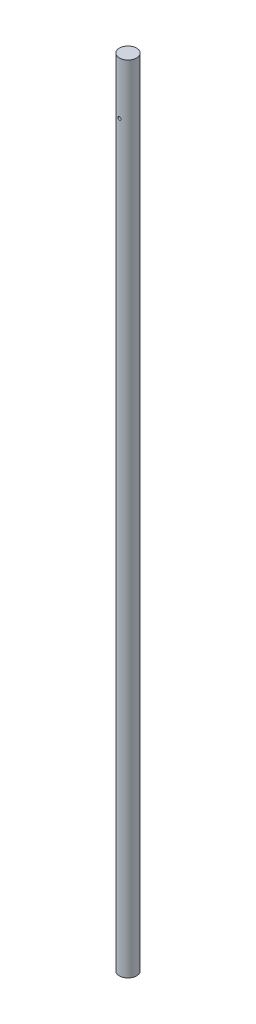
ISO-10303-21;
HEADER;
FILE_DESCRIPTION(('STEP AP214'),'2;1');
FILE_NAME('part.step','',(''),(''),'','','');
FILE_SCHEMA(('AUTOMOTIVE_DESIGN { 1 0 10303 214 1 1 1 1 }'));
ENDSEC;
DATA;
#1=APPLICATION_CONTEXT('core data for automotive mechanical design processes');
#2=APPLICATION_PROTOCOL_DEFINITION('international standard','automotive_design',2000,#1);
#3=PRODUCT_CONTEXT('',#1,'mechanical');
#4=PRODUCT('Part','Part','',(#3));
#5=PRODUCT_RELATED_PRODUCT_CATEGORY('part','',(#4));
#6=PRODUCT_DEFINITION_FORMATION('','',#4);
#7=PRODUCT_DEFINITION_CONTEXT('part definition',#1,'design');
#8=PRODUCT_DEFINITION('design','',#6,#7);
#9=PRODUCT_DEFINITION_SHAPE('','',#8);
#10=(LENGTH_UNIT() NAMED_UNIT(*) SI_UNIT(.MILLI.,.METRE.));
#11=(NAMED_UNIT(*) PLANE_ANGLE_UNIT() SI_UNIT($,.RADIAN.));
#12=(NAMED_UNIT(*) SI_UNIT($,.STERADIAN.) SOLID_ANGLE_UNIT());
#13=UNCERTAINTY_MEASURE_WITH_UNIT(LENGTH_MEASURE(1.E-05),#10,'distance_accuracy_value','');
#14=(GEOMETRIC_REPRESENTATION_CONTEXT(3) GLOBAL_UNCERTAINTY_ASSIGNED_CONTEXT((#13)) GLOBAL_UNIT_ASSIGNED_CONTEXT((#10,
#11,#12)) REPRESENTATION_CONTEXT('',''));
#15=CARTESIAN_POINT('',(0.,0.,0.));
#16=DIRECTION('',(0.,0.,1.));
#17=DIRECTION('',(1.,0.,0.));
#18=AXIS2_PLACEMENT_3D('',#15,#16,#17);
#19=CARTESIAN_POINT('',(0.,1500.,0.));
#20=DIRECTION('',(0.,-1.,0.));
#21=DIRECTION('',(0.,0.,-1.));
#22=AXIS2_PLACEMENT_3D('',#19,#20,#21);
#23=CYLINDRICAL_SURFACE('',#22,16.25);
#24=CARTESIAN_POINT('',(0.,1404.32914564067,-16.25));
#25=CARTESIAN_POINT('',(-0.166990748406522,1404.32913921038,-16.2499969931893));
#26=CARTESIAN_POINT('',(-0.334065704183964,1404.31515557109,-16.2473993044584));
#27=CARTESIAN_POINT('',(-0.663510750076011,1404.25962464219,-16.2372869543503));
#28=CARTESIAN_POINT('',(-0.82587669378066,1404.21805378697,-16.2297680892719));
#29=CARTESIAN_POINT('',(-1.14109129945687,1404.10866205032,-16.2106547951056));
#30=CARTESIAN_POINT('',(-1.29394829948251,1404.04086455373,-16.1990639975787));
#31=CARTESIAN_POINT('',(-1.58610277423743,1403.88100970992,-16.1730738034434));
#32=CARTESIAN_POINT('',(-1.72540141027467,1403.78895444294,-16.1586746476957));
#33=CARTESIAN_POINT('',(-1.9881193605143,1403.58206072673,-16.1284708734998));
#34=CARTESIAN_POINT('',(-2.11135823097165,1403.46699503101,-16.1126531819756));
#35=CARTESIAN_POINT('',(-2.33689766600412,1403.21783564233,-16.0814925513269));
#36=CARTESIAN_POINT('',(-2.43919675421193,1403.08374060883,-16.0661496457423));
#37=CARTESIAN_POINT('',(-2.62069930792588,1402.79905891854,-16.0375487829896));
#38=CARTESIAN_POINT('',(-2.69971995505486,1402.64835386056,-16.0243076876981));
#39=CARTESIAN_POINT('',(-2.83125237447274,1402.33552231303,-16.0015934725703));
#40=CARTESIAN_POINT('',(-2.88376635991726,1402.17339677832,-15.9921200381696));
#41=CARTESIAN_POINT('',(-2.96021718211588,1401.84425464954,-15.9781451500924));
#42=CARTESIAN_POINT('',(-2.98446826157052,1401.67731341075,-15.9735890655203));
#43=CARTESIAN_POINT('',(-3.00468010974617,1401.34167412396,-15.9697999512075));
#44=CARTESIAN_POINT('',(-3.00064333711198,1401.1729762299,-15.9705664588524));
#45=CARTESIAN_POINT('',(-2.96464904683336,1400.84088410826,-15.9772861635864));
#46=CARTESIAN_POINT('',(-2.93304822684279,1400.67744968101,-15.9831730961327));
#47=CARTESIAN_POINT('',(-2.84338433308752,1400.35824279567,-15.9993663109862));
#48=CARTESIAN_POINT('',(-2.78532016603667,1400.20247065442,-16.0096727758775));
#49=CARTESIAN_POINT('',(-2.64402712252059,1399.90196296112,-16.0336133834124));
#50=CARTESIAN_POINT('',(-2.56065362503224,1399.7572969862,-16.0472665609575));
#51=CARTESIAN_POINT('',(-2.37121092505861,1399.48387386111,-16.076349550406));
#52=CARTESIAN_POINT('',(-2.26513948730052,1399.35511827975,-16.0917795372189));
#53=CARTESIAN_POINT('',(-2.03138577740134,1399.11510936863,-16.1229666648261));
#54=CARTESIAN_POINT('',(-1.90339826990373,1399.0041532866,-16.138725203635));
#55=CARTESIAN_POINT('',(-1.63046847336349,1398.80524267303,-16.16857715743));
#56=CARTESIAN_POINT('',(-1.48552602404784,1398.71728835895,-16.1826705566731));
#57=CARTESIAN_POINT('',(-1.18249510750696,1398.56683663616,-16.2076314364601));
#58=CARTESIAN_POINT('',(-1.02439129145662,1398.50436946593,-16.2184950810362));
#59=CARTESIAN_POINT('',(-0.699689597220758,1398.40696217655,-16.2357426253031));
#60=CARTESIAN_POINT('',(-0.533092595258714,1398.37201922387,-16.2421269861125));
#61=CARTESIAN_POINT('',(-0.198691607679679,1398.33106444276,-16.2496334732719));
#62=CARTESIAN_POINT('',(-0.0309391242633955,1398.32464522728,-16.2508296926954));
#63=CARTESIAN_POINT('',(0.303242454906818,1398.33982833108,-16.2480295318427));
#64=CARTESIAN_POINT('',(0.469671613237506,1398.36142931732,-16.2440333985867));
#65=CARTESIAN_POINT('',(0.795194961889502,1398.43170092045,-16.2313436394118));
#66=CARTESIAN_POINT('',(0.954335024232843,1398.48016604455,-16.2226856875138));
#67=CARTESIAN_POINT('',(1.26223093849576,1398.60256828402,-16.2016390601323));
#68=CARTESIAN_POINT('',(1.41098610150155,1398.67650708735,-16.1892501374326));
#69=CARTESIAN_POINT('',(1.6956327395767,1398.84866404323,-16.1619310186895));
#70=CARTESIAN_POINT('',(1.8313706640138,1398.94713193149,-16.1469752087126));
#71=CARTESIAN_POINT('',(2.0845421763647,1399.1652131747,-16.1162488496669));
#72=CARTESIAN_POINT('',(2.20197410901898,1399.28482843975,-16.1004782270929));
#73=CARTESIAN_POINT('',(2.41674271353206,1399.5436509116,-16.0696547785828));
#74=CARTESIAN_POINT('',(2.51380175615245,1399.68309013404,-16.054613781122));
#75=CARTESIAN_POINT('',(2.68311937298541,1399.97653297996,-16.0271880822755));
#76=CARTESIAN_POINT('',(2.75537885119932,1400.1305360723,-16.0148032840714));
#77=CARTESIAN_POINT('',(2.8726493810387,1400.4480199125,-15.9941844859827));
#78=CARTESIAN_POINT('',(2.91778926237291,1400.61145174226,-15.9859308928403));
#79=CARTESIAN_POINT('',(2.97993782777897,1400.94374608357,-15.9744635860761));
#80=CARTESIAN_POINT('',(2.99694957789979,1401.11260800117,-15.9712493231544));
#81=CARTESIAN_POINT('',(3.00225883844445,1401.44818953388,-15.970251870614));
#82=CARTESIAN_POINT('',(2.99099413231231,1401.6149021345,-15.97238587689));
#83=CARTESIAN_POINT('',(2.94102698494465,1401.94401418782,-15.9816612146416));
#84=CARTESIAN_POINT('',(2.90232469587026,1402.10641366444,-15.988802518348));
#85=CARTESIAN_POINT('',(2.7987633004443,1402.42206363133,-16.0072534221724));
#86=CARTESIAN_POINT('',(2.73395019866579,1402.57532967139,-16.0185556880998));
#87=CARTESIAN_POINT('',(2.58005440045498,1402.86888248486,-16.0440604738932));
#88=CARTESIAN_POINT('',(2.49097006205162,1403.00916837928,-16.058263189961));
#89=CARTESIAN_POINT('',(2.28953267949521,1403.27497443114,-16.0882264295535));
#90=CARTESIAN_POINT('',(2.17686050825663,1403.40025057059,-16.1040065806901));
#91=CARTESIAN_POINT('',(1.93211250705098,1403.6302644882,-16.1351984458799));
#92=CARTESIAN_POINT('',(1.80003222426299,1403.73499754024,-16.1506100744366));
#93=CARTESIAN_POINT('',(1.5188437124447,1403.92179999195,-16.1794852499055));
#94=CARTESIAN_POINT('',(1.36959751004411,1404.00366457749,-16.1929307079667));
#95=CARTESIAN_POINT('',(1.05927137362299,1404.14102771242,-16.2161821483934));
#96=CARTESIAN_POINT('',(0.898202820996959,1404.19655124572,-16.2259915775145));
#97=CARTESIAN_POINT('',(0.61386466592793,1404.26826862272,-16.2388451896062));
#98=CARTESIAN_POINT('',(0.492266320876404,1404.29105885181,-16.2430048058652));
#99=CARTESIAN_POINT('',(0.247127326642421,1404.32149955774,-16.2485832906629));
#100=CARTESIAN_POINT('',(0.123586724363565,1404.32915039961,-16.2500022252843));
#101=CARTESIAN_POINT('',(0.,1404.32914564067,-16.25));
#102=B_SPLINE_CURVE_WITH_KNOTS('',3,(#24,#25,#26,#27,#28,#29,#30,#31,#32,#33,#34,#35,#36,#37,
#38,#39,#40,#41,#42,#43,#44,#45,#46,#47,#48,#49,#50,#51,#52,#53,#54,#55,#56,#57,#58,#59,#60,#61,
#62,#63,#64,#65,#66,#67,#68,#69,#70,#71,#72,#73,#74,#75,#76,#77,#78,#79,#80,#81,#82,#83,#84,#85,
#86,#87,#88,#89,#90,#91,#92,#93,#94,#95,#96,#97,#98,#99,#100,#101),.UNSPECIFIED.,.T.,.F.,(4,2,2,
2,2,2,2,2,2,2,2,2,2,2,2,2,2,2,2,2,2,2,2,2,2,2,2,2,2,2,2,2,2,2,2,2,2,2,4),(0.,0.500520313143171,
1.00146873301012,1.50197151053382,2.00243138094156,2.50810222383683,3.01380870697637,
3.52338692194337,4.03292258298424,4.5367371998035,5.040508028009,5.5378548446814,
6.03522221021627,6.53548687763446,7.03580083335983,7.54375379071424,8.05171155007453,
8.56027022073788,9.06877653027074,9.56999631726773,10.0711922601603,10.5686062634814,
11.0660532329751,11.568788087258,12.071568373363,12.5808097011882,13.0900324640199,
13.5968166696747,14.1035456307191,14.6024778204238,15.1014072432122,15.5994614214479,
16.0975493018683,16.6028705542164,17.1083079244305,17.6181366775963,18.1274808976006,
18.4979155361608,18.8683412427886),.UNSPECIFIED.);
#103=CARTESIAN_POINT('',(0.,1404.32914564067,-16.25));
#104=VERTEX_POINT('',#103);
#105=EDGE_CURVE('E10',#104,#104,#102,.T.);
#106=ORIENTED_EDGE('',*,*,#105,.T.);
#107=EDGE_LOOP('',(#106));
#108=FACE_BOUND('',#107,.T.);
#109=CARTESIAN_POINT('',(3.,1401.32914564067,15.9706762536844));
#110=CARTESIAN_POINT('',(2.99999354777675,1401.16218222839,15.9706794597759));
#111=CARTESIAN_POINT('',(2.98601433158227,1400.99513454677,15.9733229245078));
#112=CARTESIAN_POINT('',(2.93050256371947,1400.66574614098,15.9835985131928));
#113=CARTESIAN_POINT('',(2.88894634320748,1400.50340958532,15.9912349224169));
#114=CARTESIAN_POINT('',(2.77959739628982,1400.18825720017,16.0106027109374));
#115=CARTESIAN_POINT('',(2.71182874366636,1400.0354327837,16.022330331854));
#116=CARTESIAN_POINT('',(2.55204188071271,1399.74333318108,16.0485546895875));
#117=CARTESIAN_POINT('',(2.46002568319122,1399.6040568716,16.0630511965294));
#118=CARTESIAN_POINT('',(2.25317191477204,1399.34131485868,16.0933753619552));
#119=CARTESIAN_POINT('',(2.13809833041726,1399.21803640377,16.1092157194583));
#120=CARTESIAN_POINT('',(1.88890639443754,1398.9924202419,16.1403305247396));
#121=CARTESIAN_POINT('',(1.75478681166655,1398.89008388971,16.155604935854));
#122=CARTESIAN_POINT('',(1.47008247559534,1398.70854143893,16.1840026485545));
#123=CARTESIAN_POINT('',(1.3193835433783,1398.62951156546,16.1971092478474));
#124=CARTESIAN_POINT('',(1.00656526274699,1398.49796041381,16.2195525507175));
#125=CARTESIAN_POINT('',(0.844446825747186,1398.44543702282,16.2288895547545));
#126=CARTESIAN_POINT('',(0.515331102463596,1398.36896790968,16.2426519505925));
#127=CARTESIAN_POINT('',(0.348409430124719,1398.34470666578,16.2471315313766));
#128=CARTESIAN_POINT('',(0.0128088004499623,1398.32446770314,16.2508610434255));
#129=CARTESIAN_POINT('',(-0.155870010474528,1398.32848764644,16.2501114069826));
#130=CARTESIAN_POINT('',(-0.488033874506789,1398.36445437126,16.2435093748819));
#131=CARTESIAN_POINT('',(-0.651557123478107,1398.3960614402,16.2377190533405));
#132=CARTESIAN_POINT('',(-0.970938386011763,1398.48576826662,16.2217558088034));
#133=CARTESIAN_POINT('',(-1.12679612635382,1398.54386896766,16.21158272972));
#134=CARTESIAN_POINT('',(-1.4274111235155,1398.68523948599,16.1878929801162));
#135=CARTESIAN_POINT('',(-1.5721027533246,1398.76864570718,16.1743582629772));
#136=CARTESIAN_POINT('',(-1.8455635013331,1398.95815924923,16.1454430573474));
#137=CARTESIAN_POINT('',(-1.97433104593745,1399.06426881077,16.1300623867377));
#138=CARTESIAN_POINT('',(-2.21430037510118,1399.29805077093,16.0988899829771));
#139=CARTESIAN_POINT('',(-2.32521249475572,1399.42602033718,16.0830955382294));
#140=CARTESIAN_POINT('',(-2.5240427889418,1399.69889816542,16.0530947028669));
#141=CARTESIAN_POINT('',(-2.61196064700433,1399.84380666051,16.0388883341104));
#142=CARTESIAN_POINT('',(-2.76238558105924,1400.14682596925,16.0136685487596));
#143=CARTESIAN_POINT('',(-2.82485161332127,1400.30495761567,16.0026602976023));
#144=CARTESIAN_POINT('',(-2.92224821523406,1400.62972014687,15.9851630672249));
#145=CARTESIAN_POINT('',(-2.9571818023361,1400.79635009813,15.9786735927732));
#146=CARTESIAN_POINT('',(-2.99810114582988,1401.13077013267,15.971046358097));
#147=CARTESIAN_POINT('',(-3.00450259132285,1401.29850765184,15.9698317542347));
#148=CARTESIAN_POINT('',(-2.98928929224691,1401.63265513164,15.97268628894));
#149=CARTESIAN_POINT('',(-2.96767588861772,1401.79906515543,15.9767551746116));
#150=CARTESIAN_POINT('',(-2.89740292808406,1402.12447399469,15.9896467322389));
#151=CARTESIAN_POINT('',(-2.84896036886119,1402.28352131861,15.9984312462829));
#152=CARTESIAN_POINT('',(-2.72663405906852,1402.59124165801,16.0197315181041));
#153=CARTESIAN_POINT('',(-2.65274848351888,1402.73991392838,16.032247543527));
#154=CARTESIAN_POINT('',(-2.48067322170112,1403.02449793051,16.059776105751));
#155=CARTESIAN_POINT('',(-2.38222038834149,1403.16024794609,16.0748150539442));
#156=CARTESIAN_POINT('',(-2.16416108164263,1403.41345078917,16.105620237341));
#157=CARTESIAN_POINT('',(-2.04455276697753,1403.53090202232,16.1213865357631));
#158=CARTESIAN_POINT('',(-1.78572328816145,1403.74572119773,16.1521163309701));
#159=CARTESIAN_POINT('',(-1.64626858473754,1403.84280990837,16.1670668159048));
#160=CARTESIAN_POINT('',(-1.35278600878872,1404.01217951172,16.1942630633782));
#161=CARTESIAN_POINT('',(-1.19875868545359,1404.08446133884,16.2065089277864));
#162=CARTESIAN_POINT('',(-0.881283032110591,1404.20174494195,16.2268601132755));
#163=CARTESIAN_POINT('',(-0.717887243845897,1404.24688514453,16.2349864108848));
#164=CARTESIAN_POINT('',(-0.385669631467762,1404.30904653143,16.246272219738));
#165=CARTESIAN_POINT('',(-0.216848361869866,1404.32607058012,16.2494322369274));
#166=CARTESIAN_POINT('',(0.118747704707803,1404.33141918498,16.2504197985129));
#167=CARTESIAN_POINT('',(0.285515689688133,1404.32016591994,16.2483257859918));
#168=CARTESIAN_POINT('',(0.614741545752406,1404.27020230881,16.2392031583745));
#169=CARTESIAN_POINT('',(0.777199455456259,1404.23149220882,16.2321745875094));
#170=CARTESIAN_POINT('',(1.09297936585808,1404.12788942784,16.2139720430151));
#171=CARTESIAN_POINT('',(1.24631610722904,1404.06304038618,16.2028049811471));
#172=CARTESIAN_POINT('',(1.53999557536848,1403.90905059106,16.1775357709178));
#173=CARTESIAN_POINT('',(1.68033746660064,1403.81990827706,16.1634334340149));
#174=CARTESIAN_POINT('',(1.9461506514831,1403.6184027985,16.1336033970312));
#175=CARTESIAN_POINT('',(2.07138804784198,1403.50573399834,16.1178558238246));
#176=CARTESIAN_POINT('',(2.3013253609755,1403.2610092354,16.0866373015376));
#177=CARTESIAN_POINT('',(2.40602044567497,1403.12894872394,16.0711664183176));
#178=CARTESIAN_POINT('',(2.59277671744308,1402.84778033234,16.0421023052171));
#179=CARTESIAN_POINT('',(2.67462754970741,1402.69853081917,16.0285270664137));
#180=CARTESIAN_POINT('',(2.81196408585683,1402.38819870641,16.0050071148391));
#181=CARTESIAN_POINT('',(2.86747488923755,1402.22712754144,15.9950589479226));
#182=CARTESIAN_POINT('',(2.93916049492629,1401.94282235911,15.9820131761365));
#183=CARTESIAN_POINT('',(2.96193657807252,1401.82126170405,15.9777868392098));
#184=CARTESIAN_POINT('',(2.99235852299139,1401.57619792719,15.9721172276098));
#185=CARTESIAN_POINT('',(3.00000477450181,1401.45269485549,15.970673881248));
#186=CARTESIAN_POINT('',(3.,1401.32914564067,15.9706762536844));
#187=B_SPLINE_CURVE_WITH_KNOTS('',3,(#109,#110,#111,#112,#113,#114,#115,#116,#117,#118,#119,
#120,#121,#122,#123,#124,#125,#126,#127,#128,#129,#130,#131,#132,#133,#134,#135,#136,#137,#138,
#139,#140,#141,#142,#143,#144,#145,#146,#147,#148,#149,#150,#151,#152,#153,#154,#155,#156,#157,
#158,#159,#160,#161,#162,#163,#164,#165,#166,#167,#168,#169,#170,#171,#172,#173,#174,#175,#176,
#177,#178,#179,#180,#181,#182,#183,#184,#185,#186),.UNSPECIFIED.,.T.,.F.,(4,2,2,2,2,2,2,2,2,2,2,
2,2,2,2,2,2,2,2,2,2,2,2,2,2,2,2,2,2,2,2,2,2,2,2,2,2,2,4),(0.,0.500438156684197,1.00130638686238,
1.50171570229904,2.00208349142415,2.50786186721795,3.01367295175818,3.52321589904848,
4.03271822463385,4.53647617945055,5.04019248977093,5.53779209665988,6.03540942656375,
6.5357582012866,7.03615638030867,7.54399523169793,8.05184107208306,8.5605026562576,
9.06910848530204,9.57027961399998,10.0714267548676,10.568578528325,11.0657659689771,
11.5685265026893,12.0713308171088,12.5806346209648,13.0899192386275,13.5965838922151,
14.1031969254119,14.6022913276744,15.1013812563505,15.5996413758659,16.0979335100448,
16.6031540423846,17.1084932733705,17.6183428161172,18.1277055411018,18.4980281957539,
18.8683413109338),.UNSPECIFIED.);
#188=CARTESIAN_POINT('',(3.,1401.32914564067,15.9706762536844));
#189=VERTEX_POINT('',#188);
#190=EDGE_CURVE('E40',#189,#189,#187,.T.);
#191=ORIENTED_EDGE('',*,*,#190,.T.);
#192=EDGE_LOOP('',(#191));
#193=FACE_BOUND('',#192,.T.);
#194=CARTESIAN_POINT('',(0.,1500.,0.));
#195=DIRECTION('',(0.,1.,0.));
#196=DIRECTION('',(0.,0.,1.));
#197=AXIS2_PLACEMENT_3D('',#194,#195,#196);
#198=CIRCLE('',#197,16.25);
#199=CARTESIAN_POINT('',(0.,1500.,16.25));
#200=VERTEX_POINT('',#199);
#201=EDGE_CURVE('E44',#200,#200,#198,.T.);
#202=ORIENTED_EDGE('',*,*,#201,.F.);
#203=EDGE_LOOP('',(#202));
#204=FACE_BOUND('',#203,.T.);
#205=CARTESIAN_POINT('',(0.,0.,0.));
#206=DIRECTION('',(0.,1.,0.));
#207=DIRECTION('',(0.,0.,1.));
#208=AXIS2_PLACEMENT_3D('',#205,#206,#207);
#209=CIRCLE('',#208,16.25);
#210=CARTESIAN_POINT('',(0.,0.,16.25));
#211=VERTEX_POINT('',#210);
#212=EDGE_CURVE('E48',#211,#211,#209,.T.);
#213=ORIENTED_EDGE('',*,*,#212,.T.);
#214=EDGE_LOOP('',(#213));
#215=FACE_BOUND('',#214,.T.);
#216=ADVANCED_FACE('F30',(#108,#193,#204,#215),#23,.T.);
#217=CARTESIAN_POINT('',(0.,1500.,0.));
#218=DIRECTION('',(0.,1.,0.));
#219=DIRECTION('',(0.,0.,1.));
#220=AXIS2_PLACEMENT_3D('',#217,#218,#219);
#221=PLANE('',#220);
#222=ORIENTED_EDGE('',*,*,#201,.T.);
#223=EDGE_LOOP('',(#222));
#224=FACE_BOUND('',#223,.T.);
#225=ADVANCED_FACE('F59',(#224),#221,.T.);
#226=CARTESIAN_POINT('',(0.,0.,0.));
#227=DIRECTION('',(0.,1.,0.));
#228=DIRECTION('',(0.,0.,1.));
#229=AXIS2_PLACEMENT_3D('',#226,#227,#228);
#230=PLANE('',#229);
#231=ORIENTED_EDGE('',*,*,#212,.F.);
#232=EDGE_LOOP('',(#231));
#233=FACE_BOUND('',#232,.T.);
#234=ADVANCED_FACE('F57',(#233),#230,.F.);
#235=CARTESIAN_POINT('',(0.,1401.32914564067,16.25));
#236=DIRECTION('',(0.,0.,1.));
#237=DIRECTION('',(1.,0.,0.));
#238=AXIS2_PLACEMENT_3D('',#235,#236,#237);
#239=CYLINDRICAL_SURFACE('',#238,3.);
#240=ORIENTED_EDGE('',*,*,#190,.F.);
#241=EDGE_LOOP('',(#240));
#242=FACE_BOUND('',#241,.T.);
#243=ORIENTED_EDGE('',*,*,#105,.F.);
#244=EDGE_LOOP('',(#243));
#245=FACE_BOUND('',#244,.T.);
#246=ADVANCED_FACE('F53',(#242,#245),#239,.F.);
#247=CLOSED_SHELL('',(#216,#225,#234,#246));
#248=MANIFOLD_SOLID_BREP('B2',#247);
#249=ADVANCED_BREP_SHAPE_REPRESENTATION('',(#18,#248),#14);
#250=SHAPE_DEFINITION_REPRESENTATION(#9,#249);
ENDSEC;
END-ISO-10303-21;
